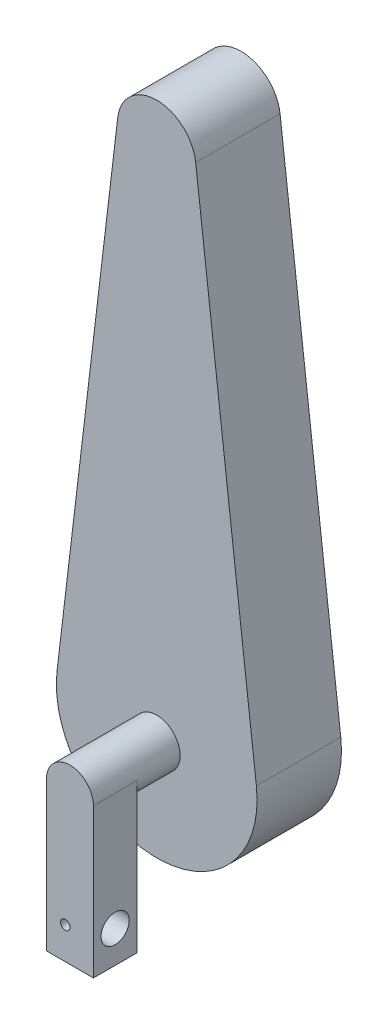
ISO-10303-21;
HEADER;
FILE_DESCRIPTION(('STEP AP214'),'2;1');
FILE_NAME('part.step','',(''),(''),'','','');
FILE_SCHEMA(('AUTOMOTIVE_DESIGN { 1 0 10303 214 1 1 1 1 }'));
ENDSEC;
DATA;
#1=APPLICATION_CONTEXT('core data for automotive mechanical design processes');
#2=APPLICATION_PROTOCOL_DEFINITION('international standard','automotive_design',2000,#1);
#3=PRODUCT_CONTEXT('',#1,'mechanical');
#4=PRODUCT('Part','Part','',(#3));
#5=PRODUCT_RELATED_PRODUCT_CATEGORY('part','',(#4));
#6=PRODUCT_DEFINITION_FORMATION('','',#4);
#7=PRODUCT_DEFINITION_CONTEXT('part definition',#1,'design');
#8=PRODUCT_DEFINITION('design','',#6,#7);
#9=PRODUCT_DEFINITION_SHAPE('','',#8);
#10=(LENGTH_UNIT() NAMED_UNIT(*) SI_UNIT(.MILLI.,.METRE.));
#11=(NAMED_UNIT(*) PLANE_ANGLE_UNIT() SI_UNIT($,.RADIAN.));
#12=(NAMED_UNIT(*) SI_UNIT($,.STERADIAN.) SOLID_ANGLE_UNIT());
#13=UNCERTAINTY_MEASURE_WITH_UNIT(LENGTH_MEASURE(1.E-05),#10,'distance_accuracy_value','');
#14=(GEOMETRIC_REPRESENTATION_CONTEXT(3) GLOBAL_UNCERTAINTY_ASSIGNED_CONTEXT((#13)) GLOBAL_UNIT_ASSIGNED_CONTEXT((#10,
#11,#12)) REPRESENTATION_CONTEXT('',''));
#15=CARTESIAN_POINT('',(0.,0.,0.));
#16=DIRECTION('',(0.,0.,1.));
#17=DIRECTION('',(1.,0.,0.));
#18=AXIS2_PLACEMENT_3D('',#15,#16,#17);
#19=CARTESIAN_POINT('',(-9.57914625306004,-3.17045801010285,36.5));
#20=DIRECTION('',(0.,0.,-1.));
#21=DIRECTION('',(-1.,0.,0.));
#22=AXIS2_PLACEMENT_3D('',#19,#20,#21);
#23=CYLINDRICAL_SURFACE('',#22,5.);
#24=CARTESIAN_POINT('',(-9.57914625306004,-3.17045801010285,18.));
#25=DIRECTION('',(0.,0.,-1.));
#26=DIRECTION('',(-1.,0.,0.));
#27=AXIS2_PLACEMENT_3D('',#24,#25,#26);
#28=CIRCLE('',#27,5.);
#29=CARTESIAN_POINT('',(-14.57914625306,-3.17045801010285,18.));
#30=VERTEX_POINT('',#29);
#31=EDGE_CURVE('E210',#30,#30,#28,.F.);
#32=ORIENTED_EDGE('',*,*,#31,.T.);
#33=EDGE_LOOP('',(#32));
#34=FACE_BOUND('',#33,.T.);
#35=CARTESIAN_POINT('',(-9.57914625306004,-3.17045801010285,27.25));
#36=DIRECTION('',(0.,0.,-1.));
#37=DIRECTION('',(-1.,0.,0.));
#38=AXIS2_PLACEMENT_3D('',#35,#36,#37);
#39=CIRCLE('',#38,5.);
#40=CARTESIAN_POINT('',(-5.7128565579939,0.,27.25));
#41=VERTEX_POINT('',#40);
#42=CARTESIAN_POINT('',(-4.57914625306004,-3.17045801010285,27.25));
#43=VERTEX_POINT('',#42);
#44=EDGE_CURVE('E214',#41,#43,#39,.T.);
#45=ORIENTED_EDGE('',*,*,#44,.T.);
#46=CARTESIAN_POINT('',(-14.57914625306,-3.17045801010285,27.25));
#47=VERTEX_POINT('',#46);
#48=EDGE_CURVE('E219',#43,#47,#39,.T.);
#49=ORIENTED_EDGE('',*,*,#48,.T.);
#50=CARTESIAN_POINT('',(-13.4454359481262,0.,27.25));
#51=VERTEX_POINT('',#50);
#52=EDGE_CURVE('E218',#47,#51,#39,.T.);
#53=ORIENTED_EDGE('',*,*,#52,.T.);
#54=ORIENTED_EDGE('',*,*,#52,.F.);
#55=DIRECTION('',(0.,0.,-1.));
#56=VECTOR('',#55,1.);
#57=CARTESIAN_POINT('',(-14.57914625306,-3.17045801010285,36.5));
#58=LINE('',#57,#56);
#59=CARTESIAN_POINT('',(-14.57914625306,-3.17045801010285,36.5));
#60=VERTEX_POINT('',#59);
#61=EDGE_CURVE('E60',#60,#47,#58,.T.);
#62=ORIENTED_EDGE('',*,*,#61,.F.);
#63=CARTESIAN_POINT('',(-9.57914625306004,-3.17045801010285,36.5));
#64=DIRECTION('',(0.,0.,1.));
#65=DIRECTION('',(1.,0.,0.));
#66=AXIS2_PLACEMENT_3D('',#63,#64,#65);
#67=CIRCLE('',#66,5.);
#68=CARTESIAN_POINT('',(-4.57914625306004,-3.17045801010285,36.5));
#69=VERTEX_POINT('',#68);
#70=EDGE_CURVE('E67',#69,#60,#67,.T.);
#71=ORIENTED_EDGE('',*,*,#70,.F.);
#72=DIRECTION('',(0.,0.,-1.));
#73=VECTOR('',#72,1.);
#74=CARTESIAN_POINT('',(-4.57914625306004,-3.17045801010285,36.5));
#75=LINE('',#74,#73);
#76=EDGE_CURVE('E11',#69,#43,#75,.T.);
#77=ORIENTED_EDGE('',*,*,#76,.T.);
#78=ORIENTED_EDGE('',*,*,#44,.F.);
#79=EDGE_LOOP('',(#45,#49,#53,#54,#62,#71,#77,#78));
#80=FACE_BOUND('',#79,.T.);
#81=ADVANCED_FACE('F45',(#34,#80),#23,.T.);
#82=CARTESIAN_POINT('',(-9.57914625306004,-3.17045801010285,18.));
#83=DIRECTION('',(0.,0.,-1.));
#84=DIRECTION('',(-1.,0.,0.));
#85=AXIS2_PLACEMENT_3D('',#82,#83,#84);
#86=CYLINDRICAL_SURFACE('',#85,21.4078793160655);
#87=CARTESIAN_POINT('',(-9.57914625306004,-3.17045801010285,0.));
#88=DIRECTION('',(0.,0.,1.));
#89=DIRECTION('',(-1.,0.,0.));
#90=AXIS2_PLACEMENT_3D('',#87,#88,#89);
#91=CIRCLE('',#90,21.4078793160655);
#92=CARTESIAN_POINT('',(-30.8367811450246,-0.638609750203943,0.));
#93=VERTEX_POINT('',#92);
#94=CARTESIAN_POINT('',(11.6784886389046,-0.63860975020394,0.));
#95=VERTEX_POINT('',#94);
#96=EDGE_CURVE('E168',#93,#95,#91,.T.);
#97=ORIENTED_EDGE('',*,*,#96,.T.);
#98=DIRECTION('',(0.,0.,-1.));
#99=VECTOR('',#98,1.);
#100=CARTESIAN_POINT('',(11.6784886389046,-0.63860975020394,18.));
#101=LINE('',#100,#99);
#102=CARTESIAN_POINT('',(11.6784886389046,-0.63860975020394,18.));
#103=VERTEX_POINT('',#102);
#104=EDGE_CURVE('E206',#103,#95,#101,.T.);
#105=ORIENTED_EDGE('',*,*,#104,.F.);
#106=CARTESIAN_POINT('',(-9.57914625306004,-3.17045801010285,18.));
#107=DIRECTION('',(0.,0.,1.));
#108=DIRECTION('',(-1.,0.,0.));
#109=AXIS2_PLACEMENT_3D('',#106,#107,#108);
#110=CIRCLE('',#109,21.4078793160655);
#111=CARTESIAN_POINT('',(-30.8367811450246,-0.638609750203943,18.));
#112=VERTEX_POINT('',#111);
#113=EDGE_CURVE('E169',#112,#103,#110,.T.);
#114=ORIENTED_EDGE('',*,*,#113,.F.);
#115=DIRECTION('',(0.,0.,-1.));
#116=VECTOR('',#115,1.);
#117=CARTESIAN_POINT('',(-30.8367811450246,-0.638609750203943,18.));
#118=LINE('',#117,#116);
#119=EDGE_CURVE('E183',#112,#93,#118,.T.);
#120=ORIENTED_EDGE('',*,*,#119,.T.);
#121=EDGE_LOOP('',(#97,#105,#114,#120));
#122=FACE_BOUND('',#121,.T.);
#123=ADVANCED_FACE('F47',(#122),#86,.T.);
#124=CARTESIAN_POINT('',(-1.26538114299195,108.039332080195,18.));
#125=DIRECTION('',(-0.99298181656003,-0.118267121302337,0.));
#126=DIRECTION('',(0.118267121302337,-0.992981816560031,0.));
#127=AXIS2_PLACEMENT_3D('',#124,#125,#126);
#128=PLANE('',#127);
#129=DIRECTION('',(-0.118267121302337,0.992981816560031,0.));
#130=VECTOR('',#129,1.);
#131=CARTESIAN_POINT('',(-1.26538114299195,108.039332080195,0.));
#132=LINE('',#131,#130);
#133=CARTESIAN_POINT('',(-1.26538114299195,108.039332080195,0.));
#134=VERTEX_POINT('',#133);
#135=EDGE_CURVE('E187',#95,#134,#132,.T.);
#136=ORIENTED_EDGE('',*,*,#135,.T.);
#137=DIRECTION('',(0.,0.,-1.));
#138=VECTOR('',#137,1.);
#139=CARTESIAN_POINT('',(-1.26538114299195,108.039332080195,18.));
#140=LINE('',#139,#138);
#141=CARTESIAN_POINT('',(-1.26538114299195,108.039332080195,18.));
#142=VERTEX_POINT('',#141);
#143=EDGE_CURVE('E202',#142,#134,#140,.T.);
#144=ORIENTED_EDGE('',*,*,#143,.F.);
#145=DIRECTION('',(-0.118267121302337,0.992981816560031,0.));
#146=VECTOR('',#145,1.);
#147=CARTESIAN_POINT('',(-1.26538114299195,108.039332080195,18.));
#148=LINE('',#147,#146);
#149=EDGE_CURVE('E173',#103,#142,#148,.T.);
#150=ORIENTED_EDGE('',*,*,#149,.F.);
#151=ORIENTED_EDGE('',*,*,#104,.T.);
#152=EDGE_LOOP('',(#136,#144,#150,#151));
#153=FACE_BOUND('',#152,.T.);
#154=ADVANCED_FACE('F251',(#153),#128,.F.);
#155=CARTESIAN_POINT('',(-9.57914625306005,107.049137647271,18.));
#156=DIRECTION('',(0.,0.,-1.));
#157=DIRECTION('',(-1.,0.,0.));
#158=AXIS2_PLACEMENT_3D('',#155,#156,#157);
#159=CYLINDRICAL_SURFACE('',#158,8.37252502656023);
#160=CARTESIAN_POINT('',(-9.57914625306005,107.049137647271,0.));
#161=DIRECTION('',(0.,0.,1.));
#162=DIRECTION('',(-1.,0.,0.));
#163=AXIS2_PLACEMENT_3D('',#160,#161,#162);
#164=CIRCLE('',#163,8.37252502656023);
#165=CARTESIAN_POINT('',(-17.8929113631281,108.039332080195,0.));
#166=VERTEX_POINT('',#165);
#167=EDGE_CURVE('E190',#134,#166,#164,.T.);
#168=ORIENTED_EDGE('',*,*,#167,.T.);
#169=DIRECTION('',(0.,0.,-1.));
#170=VECTOR('',#169,1.);
#171=CARTESIAN_POINT('',(-17.8929113631281,108.039332080195,18.));
#172=LINE('',#171,#170);
#173=CARTESIAN_POINT('',(-17.8929113631281,108.039332080195,18.));
#174=VERTEX_POINT('',#173);
#175=EDGE_CURVE('E198',#174,#166,#172,.T.);
#176=ORIENTED_EDGE('',*,*,#175,.F.);
#177=CARTESIAN_POINT('',(-9.57914625306005,107.049137647271,18.));
#178=DIRECTION('',(0.,0.,1.));
#179=DIRECTION('',(-1.,0.,0.));
#180=AXIS2_PLACEMENT_3D('',#177,#178,#179);
#181=CIRCLE('',#180,8.37252502656023);
#182=EDGE_CURVE('E177',#142,#174,#181,.T.);
#183=ORIENTED_EDGE('',*,*,#182,.F.);
#184=ORIENTED_EDGE('',*,*,#143,.T.);
#185=EDGE_LOOP('',(#168,#176,#183,#184));
#186=FACE_BOUND('',#185,.T.);
#187=ADVANCED_FACE('F267',(#186),#159,.T.);
#188=CARTESIAN_POINT('',(-30.8367811450246,-0.638609750203943,18.));
#189=DIRECTION('',(0.99298181656003,-0.118267121302337,0.));
#190=DIRECTION('',(0.118267121302337,0.992981816560031,0.));
#191=AXIS2_PLACEMENT_3D('',#188,#189,#190);
#192=PLANE('',#191);
#193=DIRECTION('',(-0.118267121302337,-0.992981816560031,0.));
#194=VECTOR('',#193,1.);
#195=CARTESIAN_POINT('',(-30.8367811450246,-0.638609750203943,0.));
#196=LINE('',#195,#194);
#197=EDGE_CURVE('E174',#166,#93,#196,.T.);
#198=ORIENTED_EDGE('',*,*,#197,.T.);
#199=ORIENTED_EDGE('',*,*,#119,.F.);
#200=DIRECTION('',(-0.118267121302337,-0.992981816560031,0.));
#201=VECTOR('',#200,1.);
#202=CARTESIAN_POINT('',(-30.8367811450246,-0.638609750203943,18.));
#203=LINE('',#202,#201);
#204=EDGE_CURVE('E180',#174,#112,#203,.T.);
#205=ORIENTED_EDGE('',*,*,#204,.F.);
#206=ORIENTED_EDGE('',*,*,#175,.T.);
#207=EDGE_LOOP('',(#198,#199,#205,#206));
#208=FACE_BOUND('',#207,.T.);
#209=ADVANCED_FACE('F260',(#208),#192,.F.);
#210=CARTESIAN_POINT('',(-9.57914625306004,-3.17045801010285,18.));
#211=DIRECTION('',(0.,0.,-1.));
#212=DIRECTION('',(-1.,0.,0.));
#213=AXIS2_PLACEMENT_3D('',#210,#211,#212);
#214=PLANE('',#213);
#215=ORIENTED_EDGE('',*,*,#31,.F.);
#216=EDGE_LOOP('',(#215));
#217=FACE_BOUND('',#216,.T.);
#218=ORIENTED_EDGE('',*,*,#113,.T.);
#219=ORIENTED_EDGE('',*,*,#149,.T.);
#220=ORIENTED_EDGE('',*,*,#182,.T.);
#221=ORIENTED_EDGE('',*,*,#204,.T.);
#222=EDGE_LOOP('',(#218,#219,#220,#221));
#223=FACE_BOUND('',#222,.T.);
#224=ADVANCED_FACE('F256',(#217,#223),#214,.F.);
#225=CARTESIAN_POINT('',(-9.57914625306004,-3.17045801010285,0.));
#226=DIRECTION('',(0.,0.,-1.));
#227=DIRECTION('',(-1.,0.,0.));
#228=AXIS2_PLACEMENT_3D('',#225,#226,#227);
#229=PLANE('',#228);
#230=ORIENTED_EDGE('',*,*,#96,.F.);
#231=ORIENTED_EDGE('',*,*,#197,.F.);
#232=ORIENTED_EDGE('',*,*,#167,.F.);
#233=ORIENTED_EDGE('',*,*,#135,.F.);
#234=EDGE_LOOP('',(#230,#231,#232,#233));
#235=FACE_BOUND('',#234,.T.);
#236=ADVANCED_FACE('F259',(#235),#229,.T.);
#237=CARTESIAN_POINT('',(-9.57914625306004,-3.17045801010285,36.5));
#238=DIRECTION('',(0.,0.,1.));
#239=DIRECTION('',(1.,0.,0.));
#240=AXIS2_PLACEMENT_3D('',#237,#238,#239);
#241=PLANE('',#240);
#242=CARTESIAN_POINT('',(-10.57914625306,-28.1704580101029,36.5));
#243=DIRECTION('',(0.,0.,-1.));
#244=DIRECTION('',(-1.,0.,0.));
#245=AXIS2_PLACEMENT_3D('',#242,#243,#244);
#246=CIRCLE('',#245,1.);
#247=CARTESIAN_POINT('',(-11.57914625306,-28.1704580101029,36.5));
#248=VERTEX_POINT('',#247);
#249=EDGE_CURVE('E227',#248,#248,#246,.T.);
#250=ORIENTED_EDGE('',*,*,#249,.T.);
#251=EDGE_LOOP('',(#250));
#252=FACE_BOUND('',#251,.T.);
#253=DIRECTION('',(1.,0.,0.));
#254=VECTOR('',#253,1.);
#255=CARTESIAN_POINT('',(-14.57914625306,-35.,36.5));
#256=LINE('',#255,#254);
#257=CARTESIAN_POINT('',(-14.57914625306,-35.,36.5));
#258=VERTEX_POINT('',#257);
#259=CARTESIAN_POINT('',(-4.57914625306004,-35.,36.5));
#260=VERTEX_POINT('',#259);
#261=EDGE_CURVE('E123',#258,#260,#256,.T.);
#262=ORIENTED_EDGE('',*,*,#261,.T.);
#263=DIRECTION('',(0.,1.,0.));
#264=VECTOR('',#263,1.);
#265=CARTESIAN_POINT('',(-4.57914625306004,-35.,36.5));
#266=LINE('',#265,#264);
#267=EDGE_CURVE('E128',#260,#69,#266,.T.);
#268=ORIENTED_EDGE('',*,*,#267,.T.);
#269=ORIENTED_EDGE('',*,*,#70,.T.);
#270=DIRECTION('',(0.,1.,0.));
#271=VECTOR('',#270,1.);
#272=CARTESIAN_POINT('',(-14.57914625306,-35.,36.5));
#273=LINE('',#272,#271);
#274=EDGE_CURVE('E120',#258,#60,#273,.T.);
#275=ORIENTED_EDGE('',*,*,#274,.F.);
#276=EDGE_LOOP('',(#262,#268,#269,#275));
#277=FACE_BOUND('',#276,.T.);
#278=ADVANCED_FACE('F122',(#252,#277),#241,.T.);
#279=CARTESIAN_POINT('',(-14.57914625306,-35.,36.5));
#280=DIRECTION('',(-1.,0.,0.));
#281=DIRECTION('',(0.,0.,1.));
#282=AXIS2_PLACEMENT_3D('',#279,#280,#281);
#283=PLANE('',#282);
#284=CARTESIAN_POINT('',(-14.57914625306,-28.1704580101029,31.875));
#285=DIRECTION('',(-1.,0.,0.));
#286=DIRECTION('',(0.,0.,1.));
#287=AXIS2_PLACEMENT_3D('',#284,#285,#286);
#288=CIRCLE('',#287,3.);
#289=CARTESIAN_POINT('',(-14.57914625306,-28.1704580101029,34.875));
#290=VERTEX_POINT('',#289);
#291=EDGE_CURVE('E146',#290,#290,#288,.T.);
#292=ORIENTED_EDGE('',*,*,#291,.F.);
#293=EDGE_LOOP('',(#292));
#294=FACE_BOUND('',#293,.T.);
#295=ORIENTED_EDGE('',*,*,#274,.T.);
#296=ORIENTED_EDGE('',*,*,#61,.T.);
#297=DIRECTION('',(0.,1.,0.));
#298=VECTOR('',#297,1.);
#299=CARTESIAN_POINT('',(-14.57914625306,-35.,27.25));
#300=LINE('',#299,#298);
#301=CARTESIAN_POINT('',(-14.57914625306,-35.,27.25));
#302=VERTEX_POINT('',#301);
#303=EDGE_CURVE('E144',#302,#47,#300,.T.);
#304=ORIENTED_EDGE('',*,*,#303,.F.);
#305=DIRECTION('',(0.,0.,1.));
#306=VECTOR('',#305,1.);
#307=CARTESIAN_POINT('',(-14.57914625306,-35.,36.5));
#308=LINE('',#307,#306);
#309=EDGE_CURVE('E136',#302,#258,#308,.T.);
#310=ORIENTED_EDGE('',*,*,#309,.T.);
#311=EDGE_LOOP('',(#295,#296,#304,#310));
#312=FACE_BOUND('',#311,.T.);
#313=ADVANCED_FACE('F142',(#294,#312),#283,.T.);
#314=CARTESIAN_POINT('',(-4.57914625306004,-35.,36.5));
#315=DIRECTION('',(1.,0.,0.));
#316=DIRECTION('',(0.,0.,-1.));
#317=AXIS2_PLACEMENT_3D('',#314,#315,#316);
#318=PLANE('',#317);
#319=CARTESIAN_POINT('',(-4.57914625306004,-28.1704580101029,31.875));
#320=DIRECTION('',(1.,0.,0.));
#321=DIRECTION('',(0.,0.,-1.));
#322=AXIS2_PLACEMENT_3D('',#319,#320,#321);
#323=CIRCLE('',#322,3.);
#324=CARTESIAN_POINT('',(-4.57914625306004,-28.1704580101029,28.875));
#325=VERTEX_POINT('',#324);
#326=EDGE_CURVE('E150',#325,#325,#323,.T.);
#327=ORIENTED_EDGE('',*,*,#326,.F.);
#328=EDGE_LOOP('',(#327));
#329=FACE_BOUND('',#328,.T.);
#330=DIRECTION('',(0.,1.,0.));
#331=VECTOR('',#330,1.);
#332=CARTESIAN_POINT('',(-4.57914625306004,-35.,27.25));
#333=LINE('',#332,#331);
#334=CARTESIAN_POINT('',(-4.57914625306004,-35.,27.25));
#335=VERTEX_POINT('',#334);
#336=EDGE_CURVE('E160',#335,#43,#333,.T.);
#337=ORIENTED_EDGE('',*,*,#336,.T.);
#338=ORIENTED_EDGE('',*,*,#76,.F.);
#339=ORIENTED_EDGE('',*,*,#267,.F.);
#340=DIRECTION('',(0.,0.,-1.));
#341=VECTOR('',#340,1.);
#342=CARTESIAN_POINT('',(-4.57914625306004,-35.,36.5));
#343=LINE('',#342,#341);
#344=EDGE_CURVE('E139',#260,#335,#343,.T.);
#345=ORIENTED_EDGE('',*,*,#344,.T.);
#346=EDGE_LOOP('',(#337,#338,#339,#345));
#347=FACE_BOUND('',#346,.T.);
#348=ADVANCED_FACE('F345',(#329,#347),#318,.T.);
#349=CARTESIAN_POINT('',(-14.57914625306,-35.,27.25));
#350=DIRECTION('',(0.,0.,-1.));
#351=DIRECTION('',(-1.,0.,0.));
#352=AXIS2_PLACEMENT_3D('',#349,#350,#351);
#353=PLANE('',#352);
#354=CARTESIAN_POINT('',(-10.57914625306,-28.1704580101029,27.25));
#355=DIRECTION('',(0.,0.,-1.));
#356=DIRECTION('',(-1.,0.,0.));
#357=AXIS2_PLACEMENT_3D('',#354,#355,#356);
#358=CIRCLE('',#357,1.);
#359=CARTESIAN_POINT('',(-11.57914625306,-28.1704580101029,27.25));
#360=VERTEX_POINT('',#359);
#361=EDGE_CURVE('E395',#360,#360,#358,.T.);
#362=ORIENTED_EDGE('',*,*,#361,.F.);
#363=EDGE_LOOP('',(#362));
#364=FACE_BOUND('',#363,.T.);
#365=ORIENTED_EDGE('',*,*,#48,.F.);
#366=ORIENTED_EDGE('',*,*,#336,.F.);
#367=DIRECTION('',(-1.,0.,0.));
#368=VECTOR('',#367,1.);
#369=CARTESIAN_POINT('',(-14.57914625306,-35.,27.25));
#370=LINE('',#369,#368);
#371=EDGE_CURVE('E129',#335,#302,#370,.T.);
#372=ORIENTED_EDGE('',*,*,#371,.T.);
#373=ORIENTED_EDGE('',*,*,#303,.T.);
#374=EDGE_LOOP('',(#365,#366,#372,#373));
#375=FACE_BOUND('',#374,.T.);
#376=ADVANCED_FACE('F314',(#364,#375),#353,.T.);
#377=CARTESIAN_POINT('',(0.,-35.,0.));
#378=DIRECTION('',(0.,-1.,0.));
#379=DIRECTION('',(0.,0.,-1.));
#380=AXIS2_PLACEMENT_3D('',#377,#378,#379);
#381=PLANE('',#380);
#382=ORIENTED_EDGE('',*,*,#309,.F.);
#383=ORIENTED_EDGE('',*,*,#371,.F.);
#384=ORIENTED_EDGE('',*,*,#344,.F.);
#385=ORIENTED_EDGE('',*,*,#261,.F.);
#386=EDGE_LOOP('',(#382,#383,#384,#385));
#387=FACE_BOUND('',#386,.T.);
#388=ADVANCED_FACE('F134',(#387),#381,.T.);
#389=CARTESIAN_POINT('',(-30.9870255691255,-28.1704580101029,31.875));
#390=DIRECTION('',(1.,0.,0.));
#391=DIRECTION('',(0.,0.,-1.));
#392=AXIS2_PLACEMENT_3D('',#389,#390,#391);
#393=CYLINDRICAL_SURFACE('',#392,3.);
#394=CARTESIAN_POINT('',(-11.57914625306,-28.1704580101029,28.875));
#395=CARTESIAN_POINT('',(-11.5791465067917,-28.1158946472161,28.8749998469906));
#396=CARTESIAN_POINT('',(-11.5746659869328,-28.0613328155643,28.8765023049246));
#397=CARTESIAN_POINT('',(-11.5569171442428,-27.9538162492299,28.8823478979672));
#398=CARTESIAN_POINT('',(-11.5436479091111,-27.900861681984,28.8866913279785));
#399=CARTESIAN_POINT('',(-11.508827009676,-27.7981252206011,28.8977469209356));
#400=CARTESIAN_POINT('',(-11.4872891906008,-27.7483381842168,28.9044551226915));
#401=CARTESIAN_POINT('',(-11.4366050802217,-27.6530830732975,28.9195555428266));
#402=CARTESIAN_POINT('',(-11.4074572880574,-27.6076158531441,28.9279480933222));
#403=CARTESIAN_POINT('',(-11.3413204482013,-27.5207163350806,28.9458590555699));
#404=CARTESIAN_POINT('',(-11.3041150187995,-27.4794543098045,28.9554044353622));
#405=CARTESIAN_POINT('',(-11.2233790983535,-27.4036253174008,28.9743968521688));
#406=CARTESIAN_POINT('',(-11.1798472181315,-27.3690598246134,28.9838438670945));
#407=CARTESIAN_POINT('',(-11.0861611378636,-27.306633067875,29.0018666752273));
#408=CARTESIAN_POINT('',(-11.0358525133279,-27.2789931518818,29.0104096072431));
#409=CARTESIAN_POINT('',(-10.9309701586015,-27.2326391362251,29.025246945814));
#410=CARTESIAN_POINT('',(-10.8763977358973,-27.2139223127161,29.0315420383925));
#411=CARTESIAN_POINT('',(-10.7664730315633,-27.1865845485937,29.0408869673062));
#412=CARTESIAN_POINT('',(-10.711209044571,-27.1776445618311,29.0440390423039));
#413=CARTESIAN_POINT('',(-10.5998824989042,-27.1691168867684,29.0470434337049));
#414=CARTESIAN_POINT('',(-10.5438201923508,-27.1695263084981,29.0468967697727));
#415=CARTESIAN_POINT('',(-10.435209622616,-27.1794381063994,29.0434098499182));
#416=CARTESIAN_POINT('',(-10.382617850141,-27.1885240969359,29.0402158413247));
#417=CARTESIAN_POINT('',(-10.2797528334532,-27.2148518472534,29.0312334227545));
#418=CARTESIAN_POINT('',(-10.229479867625,-27.232094583511,29.0254447021589));
#419=CARTESIAN_POINT('',(-10.1317335034686,-27.2745189520426,29.0118208886875));
#420=CARTESIAN_POINT('',(-10.0843182275905,-27.2998239613956,29.0039543420688));
#421=CARTESIAN_POINT('',(-9.99427534478031,-27.3575689037997,28.9870744142427));
#422=CARTESIAN_POINT('',(-9.95164912612666,-27.3900108977388,28.9780607020954));
#423=CARTESIAN_POINT('',(-9.87005465489927,-27.4631086774206,28.9593267083226));
#424=CARTESIAN_POINT('',(-9.83139355855097,-27.5041048600265,28.9495941064516));
#425=CARTESIAN_POINT('',(-9.76141498639664,-27.5921184401328,28.9309306161296));
#426=CARTESIAN_POINT('',(-9.73009821489554,-27.639136414442,28.9219998046193));
#427=CARTESIAN_POINT('',(-9.67544995282497,-27.7385103970566,28.9058289206221));
#428=CARTESIAN_POINT('',(-9.65220076171931,-27.7909147336865,28.8986064999196));
#429=CARTESIAN_POINT('',(-9.61494307910433,-27.8991889267383,28.8867943285557));
#430=CARTESIAN_POINT('',(-9.6009313776366,-27.9550575719479,28.8822036634512));
#431=CARTESIAN_POINT('',(-9.58309058703768,-28.0660741805735,28.8763237292856));
#432=CARTESIAN_POINT('',(-9.57884644388729,-28.121148410238,28.8748999816627));
#433=CARTESIAN_POINT('',(-9.5794789266585,-28.2312330800631,28.8751109730518));
#434=CARTESIAN_POINT('',(-9.58435401303991,-28.2862435294225,28.8767451958065));
#435=CARTESIAN_POINT('',(-9.602758160796,-28.3929778764071,28.8827997528289));
#436=CARTESIAN_POINT('',(-9.61603245910956,-28.4447508169377,28.8871380128877));
#437=CARTESIAN_POINT('',(-9.65053969752674,-28.5453139686824,28.8980815316997));
#438=CARTESIAN_POINT('',(-9.67177365252771,-28.5941037986114,28.9046870795346));
#439=CARTESIAN_POINT('',(-9.72221668490094,-28.6887463064962,28.9197106871257));
#440=CARTESIAN_POINT('',(-9.75162084634364,-28.7344879693202,28.9281718524369));
#441=CARTESIAN_POINT('',(-9.81734040307309,-28.8205228402383,28.9459474608426));
#442=CARTESIAN_POINT('',(-9.8536579090902,-28.8608143778977,28.9552621640811));
#443=CARTESIAN_POINT('',(-9.9341250040683,-28.9367105179099,28.9742315201753));
#444=CARTESIAN_POINT('',(-9.97855547999329,-28.9720189793513,28.9838823890484));
#445=CARTESIAN_POINT('',(-10.0729178208645,-29.0347155324237,29.0020002671302));
#446=CARTESIAN_POINT('',(-10.1228497316702,-29.0621035580237,29.0104672664688));
#447=CARTESIAN_POINT('',(-10.2268192683666,-29.1080549405262,29.0251760817969));
#448=CARTESIAN_POINT('',(-10.2808483323028,-29.1266361423006,29.0314223909937));
#449=CARTESIAN_POINT('',(-10.3915249031842,-29.154352676895,29.0408916760087));
#450=CARTESIAN_POINT('',(-10.4481712184931,-29.1634922650641,29.044116013773));
#451=CARTESIAN_POINT('',(-10.5593433490733,-29.1717342925732,29.0470214112493));
#452=CARTESIAN_POINT('',(-10.6138285933118,-29.1713282674138,29.046875996557));
#453=CARTESIAN_POINT('',(-10.7219113279598,-29.1617003035577,29.0434873007644));
#454=CARTESIAN_POINT('',(-10.775508871013,-29.1524788895617,29.0402442040412));
#455=CARTESIAN_POINT('',(-10.8792819160727,-29.1258298232298,29.0311547572106));
#456=CARTESIAN_POINT('',(-10.9295030780673,-29.1085613561177,29.0253590198449));
#457=CARTESIAN_POINT('',(-11.0263736599956,-29.0664373758632,29.0118360117457));
#458=CARTESIAN_POINT('',(-11.0730222842473,-29.0415801786568,29.004108312347));
#459=CARTESIAN_POINT('',(-11.1636299229837,-28.9837187026861,28.9871717077594));
#460=CARTESIAN_POINT('',(-11.2073827549586,-28.9504062528674,28.977912883584));
#461=CARTESIAN_POINT('',(-11.288836066444,-28.8771008932386,28.9591664371621));
#462=CARTESIAN_POINT('',(-11.3265348287481,-28.8371060945543,28.9496787508748));
#463=CARTESIAN_POINT('',(-11.3962906653493,-28.7496995670235,28.9310996947461));
#464=CARTESIAN_POINT('',(-11.4280706008111,-28.7020595236026,28.9220381819878));
#465=CARTESIAN_POINT('',(-11.4831366819107,-28.6018153675095,28.9057400882735));
#466=CARTESIAN_POINT('',(-11.5064249989821,-28.5492125282352,28.8985030409206));
#467=CARTESIAN_POINT('',(-11.5428678855487,-28.4429516573038,28.8869448493147));
#468=CARTESIAN_POINT('',(-11.5564287193234,-28.3894457677793,28.8825078757748));
#469=CARTESIAN_POINT('',(-11.5745665337372,-28.2807784261131,28.8765359293578));
#470=CARTESIAN_POINT('',(-11.5791459965566,-28.2256174356716,28.8750001546809));
#471=CARTESIAN_POINT('',(-11.57914625306,-28.1704580101029,28.875));
#472=B_SPLINE_CURVE_WITH_KNOTS('',3,(#394,#395,#396,#397,#398,#399,#400,#401,#402,#403,#404,
#405,#406,#407,#408,#409,#410,#411,#412,#413,#414,#415,#416,#417,#418,#419,#420,#421,#422,#423,
#424,#425,#426,#427,#428,#429,#430,#431,#432,#433,#434,#435,#436,#437,#438,#439,#440,#441,#442,
#443,#444,#445,#446,#447,#448,#449,#450,#451,#452,#453,#454,#455,#456,#457,#458,#459,#460,#461,
#462,#463,#464,#465,#466,#467,#468,#469,#470,#471),.UNSPECIFIED.,.T.,.F.,(4,2,2,2,2,2,2,2,2,2,2,
2,2,2,2,2,2,2,2,2,2,2,2,2,2,2,2,2,2,2,2,2,2,2,2,2,2,2,4),(0.,0.163487106026014,
0.326991185267523,0.490222672870278,0.653486377799105,0.821846842827567,0.990244332875311,
1.16348384823471,1.33667044692834,1.50401925741841,1.67131633987486,1.83096826551281,
1.99063930855483,2.15288171155131,2.31517102558208,2.48593305811368,2.65671145966619,
2.82918405650359,3.00159668877209,3.16653583175171,3.33144713164178,3.49158157978215,
3.65173645284105,3.81610399843738,3.98052180821893,4.15241022880754,4.32430008234999,
4.49584013824418,4.66730284700848,4.82995666056621,4.99260079341187,5.15215587070229,
5.31174638165789,5.47830066681616,5.64490211113591,5.81799660824913,5.99104681142269,
6.15636558363626,6.32163866027952),.UNSPECIFIED.);
#473=CARTESIAN_POINT('',(-11.57914625306,-28.1704580101029,28.875));
#474=VERTEX_POINT('',#473);
#475=EDGE_CURVE('E49',#474,#474,#472,.T.);
#476=ORIENTED_EDGE('',*,*,#475,.T.);
#477=EDGE_LOOP('',(#476));
#478=FACE_BOUND('',#477,.T.);
#479=CARTESIAN_POINT('',(-11.57914625306,-28.1704580101029,34.875));
#480=CARTESIAN_POINT('',(-11.5791465067917,-28.2250213729896,34.8750001530094));
#481=CARTESIAN_POINT('',(-11.5746659869328,-28.2795832046414,34.8734976950754));
#482=CARTESIAN_POINT('',(-11.5569171442428,-28.3870997709758,34.8676521020328));
#483=CARTESIAN_POINT('',(-11.5436479091111,-28.4400543382217,34.8633086720215));
#484=CARTESIAN_POINT('',(-11.508827009676,-28.5427907996046,34.8522530790644));
#485=CARTESIAN_POINT('',(-11.4872891906008,-28.5925778359889,34.8455448773085));
#486=CARTESIAN_POINT('',(-11.4366050802217,-28.6878329469082,34.8304444571734));
#487=CARTESIAN_POINT('',(-11.4074572880574,-28.7333001670616,34.8220519066778));
#488=CARTESIAN_POINT('',(-11.3413204482013,-28.8201996851251,34.8041409444301));
#489=CARTESIAN_POINT('',(-11.3041150187995,-28.8614617104012,34.7945955646378));
#490=CARTESIAN_POINT('',(-11.2233790983535,-28.9372907028049,34.7756031478312));
#491=CARTESIAN_POINT('',(-11.1798472181315,-28.9718561955923,34.7661561329055));
#492=CARTESIAN_POINT('',(-11.0861611378636,-29.0342829523307,34.7481333247727));
#493=CARTESIAN_POINT('',(-11.0358525133279,-29.0619228683239,34.7395903927569));
#494=CARTESIAN_POINT('',(-10.9309701586015,-29.1082768839806,34.724753054186));
#495=CARTESIAN_POINT('',(-10.8763977358973,-29.1269937074896,34.7184579616075));
#496=CARTESIAN_POINT('',(-10.7664730315633,-29.154331471612,34.7091130326938));
#497=CARTESIAN_POINT('',(-10.711209044571,-29.1632714583746,34.7059609576961));
#498=CARTESIAN_POINT('',(-10.5998824989042,-29.1717991334373,34.7029565662951));
#499=CARTESIAN_POINT('',(-10.5438201923508,-29.1713897117076,34.7031032302273));
#500=CARTESIAN_POINT('',(-10.435209622616,-29.1614779138063,34.7065901500818));
#501=CARTESIAN_POINT('',(-10.382617850141,-29.1523919232698,34.7097841586753));
#502=CARTESIAN_POINT('',(-10.2797528334532,-29.1260641729523,34.7187665772455));
#503=CARTESIAN_POINT('',(-10.229479867625,-29.1088214366947,34.7245552978411));
#504=CARTESIAN_POINT('',(-10.1317335034686,-29.0663970681631,34.7381791113125));
#505=CARTESIAN_POINT('',(-10.0843182275905,-29.0410920588101,34.7460456579312));
#506=CARTESIAN_POINT('',(-9.99427534478031,-28.983347116406,34.7629255857573));
#507=CARTESIAN_POINT('',(-9.95164912612665,-28.9509051224669,34.7719392979046));
#508=CARTESIAN_POINT('',(-9.87005465489927,-28.8778073427851,34.7906732916774));
#509=CARTESIAN_POINT('',(-9.83139355855097,-28.8368111601792,34.8004058935484));
#510=CARTESIAN_POINT('',(-9.76141498639664,-28.7487975800729,34.8190693838704));
#511=CARTESIAN_POINT('',(-9.73009821489554,-28.7017796057637,34.8280001953807));
#512=CARTESIAN_POINT('',(-9.67544995282497,-28.6024056231491,34.8441710793779));
#513=CARTESIAN_POINT('',(-9.6522007617193,-28.5500012865192,34.8513935000804));
#514=CARTESIAN_POINT('',(-9.61494307910433,-28.4417270934674,34.8632056714443));
#515=CARTESIAN_POINT('',(-9.6009313776366,-28.3858584482578,34.8677963365488));
#516=CARTESIAN_POINT('',(-9.58309058703768,-28.2748418396321,34.8736762707144));
#517=CARTESIAN_POINT('',(-9.57884644388729,-28.2197676099677,34.8751000183373));
#518=CARTESIAN_POINT('',(-9.5794789266585,-28.1096829401426,34.8748890269482));
#519=CARTESIAN_POINT('',(-9.58435401303991,-28.0546724907832,34.8732548041935));
#520=CARTESIAN_POINT('',(-9.602758160796,-27.9479381437986,34.8672002471711));
#521=CARTESIAN_POINT('',(-9.61603245910956,-27.896165203268,34.8628619871123));
#522=CARTESIAN_POINT('',(-9.65053969752674,-27.7956020515233,34.8519184683003));
#523=CARTESIAN_POINT('',(-9.67177365252771,-27.7468122215943,34.8453129204654));
#524=CARTESIAN_POINT('',(-9.72221668490094,-27.6521697137095,34.8302893128743));
#525=CARTESIAN_POINT('',(-9.75162084634364,-27.6064280508855,34.8218281475631));
#526=CARTESIAN_POINT('',(-9.81734040307309,-27.5203931799674,34.8040525391574));
#527=CARTESIAN_POINT('',(-9.8536579090902,-27.480101642308,34.7947378359189));
#528=CARTESIAN_POINT('',(-9.9341250040683,-27.4042055022958,34.7757684798247));
#529=CARTESIAN_POINT('',(-9.97855547999329,-27.3688970408544,34.7661176109516));
#530=CARTESIAN_POINT('',(-10.0729178208645,-27.306200487782,34.7479997328698));
#531=CARTESIAN_POINT('',(-10.1228497316702,-27.278812462182,34.7395327335312));
#532=CARTESIAN_POINT('',(-10.2268192683666,-27.2328610796795,34.7248239182031));
#533=CARTESIAN_POINT('',(-10.2808483323028,-27.2142798779051,34.7185776090063));
#534=CARTESIAN_POINT('',(-10.3915249031842,-27.1865633433107,34.7091083239913));
#535=CARTESIAN_POINT('',(-10.4481712184931,-27.1774237551416,34.705883986227));
#536=CARTESIAN_POINT('',(-10.5593433490733,-27.1691817276325,34.7029785887507));
#537=CARTESIAN_POINT('',(-10.6138285933118,-27.1695877527919,34.703124003443));
#538=CARTESIAN_POINT('',(-10.7219113279598,-27.179215716648,34.7065126992356));
#539=CARTESIAN_POINT('',(-10.775508871013,-27.188437130644,34.7097557959588));
#540=CARTESIAN_POINT('',(-10.8792819160727,-27.2150861969759,34.7188452427894));
#541=CARTESIAN_POINT('',(-10.9295030780673,-27.232354664088,34.7246409801551));
#542=CARTESIAN_POINT('',(-11.0263736599956,-27.2744786443425,34.7381639882543));
#543=CARTESIAN_POINT('',(-11.0730222842473,-27.2993358415489,34.745891687653));
#544=CARTESIAN_POINT('',(-11.1636299229837,-27.3571973175196,34.7628282922406));
#545=CARTESIAN_POINT('',(-11.2073827549586,-27.3905097673383,34.772087116416));
#546=CARTESIAN_POINT('',(-11.288836066444,-27.4638151269672,34.7908335628379));
#547=CARTESIAN_POINT('',(-11.3265348287481,-27.5038099256514,34.8003212491252));
#548=CARTESIAN_POINT('',(-11.3962906653493,-27.5912164531822,34.8189003052539));
#549=CARTESIAN_POINT('',(-11.4280706008111,-27.6388564966031,34.8279618180122));
#550=CARTESIAN_POINT('',(-11.4831366819107,-27.7391006526962,34.8442599117265));
#551=CARTESIAN_POINT('',(-11.5064249989821,-27.7917034919705,34.8514969590794));
#552=CARTESIAN_POINT('',(-11.5428678855487,-27.8979643629019,34.8630551506853));
#553=CARTESIAN_POINT('',(-11.5564287193234,-27.9514702524265,34.8674921242252));
#554=CARTESIAN_POINT('',(-11.5745665337372,-28.0601375940926,34.8734640706422));
#555=CARTESIAN_POINT('',(-11.5791459965566,-28.1152985845341,34.8749998453191));
#556=CARTESIAN_POINT('',(-11.57914625306,-28.1704580101029,34.875));
#557=B_SPLINE_CURVE_WITH_KNOTS('',3,(#479,#480,#481,#482,#483,#484,#485,#486,#487,#488,#489,
#490,#491,#492,#493,#494,#495,#496,#497,#498,#499,#500,#501,#502,#503,#504,#505,#506,#507,#508,
#509,#510,#511,#512,#513,#514,#515,#516,#517,#518,#519,#520,#521,#522,#523,#524,#525,#526,#527,
#528,#529,#530,#531,#532,#533,#534,#535,#536,#537,#538,#539,#540,#541,#542,#543,#544,#545,#546,
#547,#548,#549,#550,#551,#552,#553,#554,#555,#556),.UNSPECIFIED.,.T.,.F.,(4,2,2,2,2,2,2,2,2,2,2,
2,2,2,2,2,2,2,2,2,2,2,2,2,2,2,2,2,2,2,2,2,2,2,2,2,2,2,4),(0.,0.163487106026014,
0.326991185267523,0.490222672870278,0.653486377799105,0.82184684282757,0.990244332875311,
1.16348384823471,1.33667044692834,1.50401925741841,1.67131633987486,1.83096826551281,
1.99063930855483,2.15288171155132,2.31517102558208,2.48593305811368,2.6567114596662,
2.82918405650359,3.0015966887721,3.16653583175171,3.33144713164178,3.49158157978215,
3.65173645284105,3.81610399843738,3.98052180821892,4.15241022880753,4.32430008234998,
4.49584013824418,4.66730284700848,4.82995666056621,4.99260079341187,5.15215587070229,
5.3117463816579,5.47830066681617,5.64490211113591,5.81799660824913,5.99104681142269,
6.15636558363627,6.32163866027952),.UNSPECIFIED.);
#558=CARTESIAN_POINT('',(-11.57914625306,-28.1704580101029,34.875));
#559=VERTEX_POINT('',#558);
#560=EDGE_CURVE('E221',#559,#559,#557,.T.);
#561=ORIENTED_EDGE('',*,*,#560,.T.);
#562=EDGE_LOOP('',(#561));
#563=FACE_BOUND('',#562,.T.);
#564=ORIENTED_EDGE('',*,*,#291,.T.);
#565=EDGE_LOOP('',(#564));
#566=FACE_BOUND('',#565,.T.);
#567=ORIENTED_EDGE('',*,*,#326,.T.);
#568=EDGE_LOOP('',(#567));
#569=FACE_BOUND('',#568,.T.);
#570=ADVANCED_FACE('F228',(#478,#563,#566,#569),#393,.F.);
#571=CARTESIAN_POINT('',(-10.57914625306,-28.1704580101029,36.5));
#572=DIRECTION('',(0.,0.,-1.));
#573=DIRECTION('',(-1.,0.,0.));
#574=AXIS2_PLACEMENT_3D('',#571,#572,#573);
#575=CYLINDRICAL_SURFACE('',#574,1.);
#576=ORIENTED_EDGE('',*,*,#249,.F.);
#577=EDGE_LOOP('',(#576));
#578=FACE_BOUND('',#577,.T.);
#579=ORIENTED_EDGE('',*,*,#560,.F.);
#580=EDGE_LOOP('',(#579));
#581=FACE_BOUND('',#580,.T.);
#582=ADVANCED_FACE('F234',(#578,#581),#575,.F.);
#583=ORIENTED_EDGE('',*,*,#361,.T.);
#584=EDGE_LOOP('',(#583));
#585=FACE_BOUND('',#584,.T.);
#586=ORIENTED_EDGE('',*,*,#475,.F.);
#587=EDGE_LOOP('',(#586));
#588=FACE_BOUND('',#587,.T.);
#589=ADVANCED_FACE('F231',(#585,#588),#575,.F.);
#590=CLOSED_SHELL('',(#81,#123,#154,#187,#209,#224,#236,#278,#313,#348,#376,#388,#570,#582,#589));
#591=MANIFOLD_SOLID_BREP('B2',#590);
#592=ADVANCED_BREP_SHAPE_REPRESENTATION('',(#18,#591),#14);
#593=SHAPE_DEFINITION_REPRESENTATION(#9,#592);
ENDSEC;
END-ISO-10303-21;
